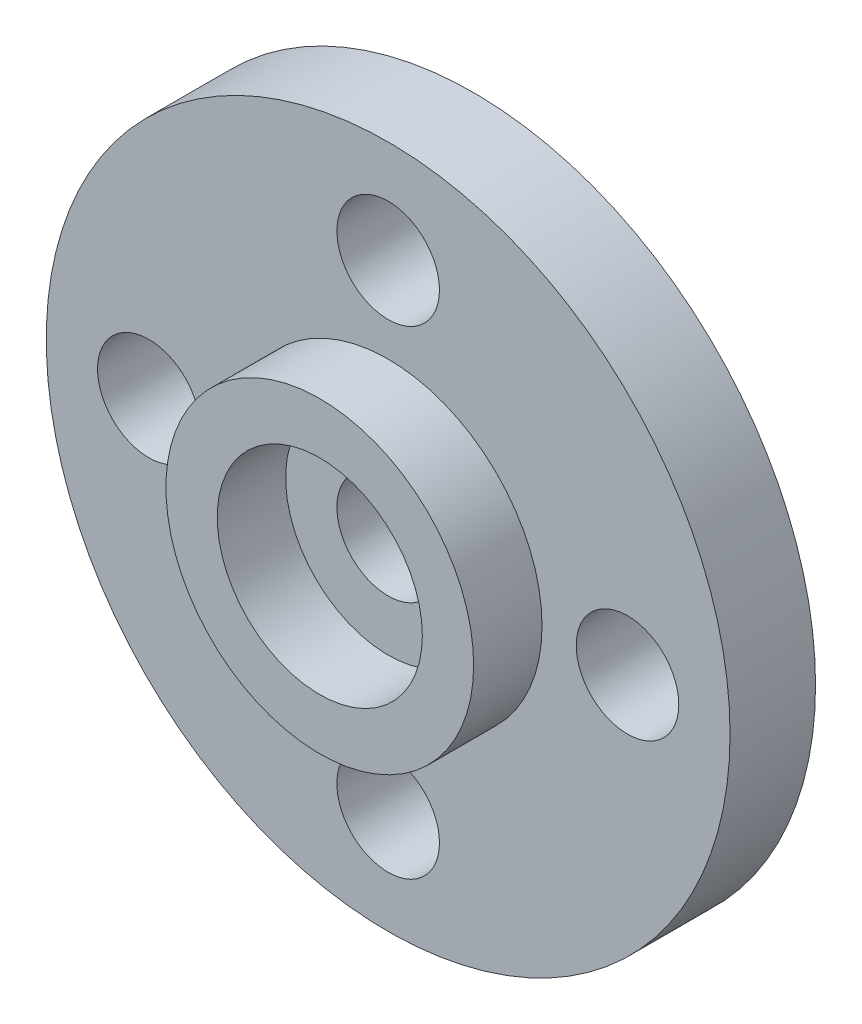
ISO-10303-21;
HEADER;
FILE_DESCRIPTION(('STEP AP214'),'2;1');
FILE_NAME('part.step','',(''),(''),'','','');
FILE_SCHEMA(('AUTOMOTIVE_DESIGN { 1 0 10303 214 1 1 1 1 }'));
ENDSEC;
DATA;
#1=APPLICATION_CONTEXT('core data for automotive mechanical design processes');
#2=APPLICATION_PROTOCOL_DEFINITION('international standard','automotive_design',2000,#1);
#3=PRODUCT_CONTEXT('',#1,'mechanical');
#4=PRODUCT('Part','Part','',(#3));
#5=PRODUCT_RELATED_PRODUCT_CATEGORY('part','',(#4));
#6=PRODUCT_DEFINITION_FORMATION('','',#4);
#7=PRODUCT_DEFINITION_CONTEXT('part definition',#1,'design');
#8=PRODUCT_DEFINITION('design','',#6,#7);
#9=PRODUCT_DEFINITION_SHAPE('','',#8);
#10=(LENGTH_UNIT() NAMED_UNIT(*) SI_UNIT(.MILLI.,.METRE.));
#11=(NAMED_UNIT(*) PLANE_ANGLE_UNIT() SI_UNIT($,.RADIAN.));
#12=(NAMED_UNIT(*) SI_UNIT($,.STERADIAN.) SOLID_ANGLE_UNIT());
#13=UNCERTAINTY_MEASURE_WITH_UNIT(LENGTH_MEASURE(1.E-05),#10,'distance_accuracy_value','');
#14=(GEOMETRIC_REPRESENTATION_CONTEXT(3) GLOBAL_UNCERTAINTY_ASSIGNED_CONTEXT((#13)) GLOBAL_UNIT_ASSIGNED_CONTEXT((#10,
#11,#12)) REPRESENTATION_CONTEXT('',''));
#15=CARTESIAN_POINT('',(0.,0.,0.));
#16=DIRECTION('',(0.,0.,1.));
#17=DIRECTION('',(1.,0.,0.));
#18=AXIS2_PLACEMENT_3D('',#15,#16,#17);
#19=CARTESIAN_POINT('',(0.,0.,2.5));
#20=DIRECTION('',(0.,0.,1.));
#21=DIRECTION('',(1.,0.,0.));
#22=AXIS2_PLACEMENT_3D('',#19,#20,#21);
#23=PLANE('',#22);
#24=CARTESIAN_POINT('',(0.,0.,2.5));
#25=DIRECTION('',(0.,0.,1.));
#26=DIRECTION('',(1.,0.,0.));
#27=AXIS2_PLACEMENT_3D('',#24,#25,#26);
#28=CIRCLE('',#27,4.5);
#29=CARTESIAN_POINT('',(4.5,0.,2.5));
#30=VERTEX_POINT('',#29);
#31=EDGE_CURVE('E90',#30,#30,#28,.T.);
#32=ORIENTED_EDGE('',*,*,#31,.F.);
#33=EDGE_LOOP('',(#32));
#34=FACE_BOUND('',#33,.T.);
#35=CARTESIAN_POINT('',(0.,-7.,2.5));
#36=DIRECTION('',(0.,0.,1.));
#37=DIRECTION('',(1.,0.,0.));
#38=AXIS2_PLACEMENT_3D('',#35,#36,#37);
#39=CIRCLE('',#38,1.5);
#40=CARTESIAN_POINT('',(1.49999999999995,-7.,2.5));
#41=VERTEX_POINT('',#40);
#42=EDGE_CURVE('E70',#41,#41,#39,.T.);
#43=ORIENTED_EDGE('',*,*,#42,.F.);
#44=EDGE_LOOP('',(#43));
#45=FACE_BOUND('',#44,.T.);
#46=CARTESIAN_POINT('',(0.,7.,2.5));
#47=DIRECTION('',(0.,0.,1.));
#48=DIRECTION('',(1.,0.,0.));
#49=AXIS2_PLACEMENT_3D('',#46,#47,#48);
#50=CIRCLE('',#49,1.5);
#51=CARTESIAN_POINT('',(1.5,7.,2.5));
#52=VERTEX_POINT('',#51);
#53=EDGE_CURVE('E56',#52,#52,#50,.T.);
#54=ORIENTED_EDGE('',*,*,#53,.F.);
#55=EDGE_LOOP('',(#54));
#56=FACE_BOUND('',#55,.T.);
#57=CARTESIAN_POINT('',(0.,0.,2.5));
#58=DIRECTION('',(0.,0.,1.));
#59=DIRECTION('',(1.,0.,0.));
#60=AXIS2_PLACEMENT_3D('',#57,#58,#59);
#61=CIRCLE('',#60,10.);
#62=CARTESIAN_POINT('',(10.,0.,2.5));
#63=VERTEX_POINT('',#62);
#64=EDGE_CURVE('E46',#63,#63,#61,.T.);
#65=ORIENTED_EDGE('',*,*,#64,.T.);
#66=EDGE_LOOP('',(#65));
#67=FACE_BOUND('',#66,.T.);
#68=CARTESIAN_POINT('',(7.,0.,2.5));
#69=DIRECTION('',(0.,0.,1.));
#70=DIRECTION('',(1.,0.,0.));
#71=AXIS2_PLACEMENT_3D('',#68,#69,#70);
#72=CIRCLE('',#71,1.5);
#73=CARTESIAN_POINT('',(8.5,0.,2.5));
#74=VERTEX_POINT('',#73);
#75=EDGE_CURVE('E62',#74,#74,#72,.T.);
#76=ORIENTED_EDGE('',*,*,#75,.F.);
#77=EDGE_LOOP('',(#76));
#78=FACE_BOUND('',#77,.T.);
#79=CARTESIAN_POINT('',(-7.0000000000001,1.71082585603315E-13,2.5));
#80=DIRECTION('',(0.,0.,1.));
#81=DIRECTION('',(1.,0.,0.));
#82=AXIS2_PLACEMENT_3D('',#79,#80,#81);
#83=CIRCLE('',#82,1.49999999999988);
#84=CARTESIAN_POINT('',(-5.50000000000022,1.71082585603315E-13,2.5));
#85=VERTEX_POINT('',#84);
#86=EDGE_CURVE('E78',#85,#85,#83,.T.);
#87=ORIENTED_EDGE('',*,*,#86,.F.);
#88=EDGE_LOOP('',(#87));
#89=FACE_BOUND('',#88,.T.);
#90=ADVANCED_FACE('F37',(#34,#45,#56,#67,#78,#89),#23,.T.);
#91=CARTESIAN_POINT('',(0.,0.,0.));
#92=DIRECTION('',(0.,0.,1.));
#93=DIRECTION('',(1.,0.,0.));
#94=AXIS2_PLACEMENT_3D('',#91,#92,#93);
#95=PLANE('',#94);
#96=CARTESIAN_POINT('',(0.,0.,0.));
#97=DIRECTION('',(0.,0.,1.));
#98=DIRECTION('',(1.,0.,0.));
#99=AXIS2_PLACEMENT_3D('',#96,#97,#98);
#100=CIRCLE('',#99,1.5);
#101=CARTESIAN_POINT('',(1.5,0.,0.));
#102=VERTEX_POINT('',#101);
#103=EDGE_CURVE('E41',#102,#102,#100,.T.);
#104=ORIENTED_EDGE('',*,*,#103,.T.);
#105=EDGE_LOOP('',(#104));
#106=FACE_BOUND('',#105,.T.);
#107=CARTESIAN_POINT('',(0.,0.,0.));
#108=DIRECTION('',(0.,0.,1.));
#109=DIRECTION('',(1.,0.,0.));
#110=AXIS2_PLACEMENT_3D('',#107,#108,#109);
#111=CIRCLE('',#110,10.);
#112=CARTESIAN_POINT('',(10.,0.,0.));
#113=VERTEX_POINT('',#112);
#114=EDGE_CURVE('E51',#113,#113,#111,.T.);
#115=ORIENTED_EDGE('',*,*,#114,.F.);
#116=EDGE_LOOP('',(#115));
#117=FACE_BOUND('',#116,.T.);
#118=CARTESIAN_POINT('',(0.,7.,0.));
#119=DIRECTION('',(0.,0.,1.));
#120=DIRECTION('',(1.,0.,0.));
#121=AXIS2_PLACEMENT_3D('',#118,#119,#120);
#122=CIRCLE('',#121,1.5);
#123=CARTESIAN_POINT('',(1.5,7.,0.));
#124=VERTEX_POINT('',#123);
#125=EDGE_CURVE('E58',#124,#124,#122,.T.);
#126=ORIENTED_EDGE('',*,*,#125,.T.);
#127=EDGE_LOOP('',(#126));
#128=FACE_BOUND('',#127,.T.);
#129=CARTESIAN_POINT('',(7.,0.,0.));
#130=DIRECTION('',(0.,0.,1.));
#131=DIRECTION('',(1.,0.,0.));
#132=AXIS2_PLACEMENT_3D('',#129,#130,#131);
#133=CIRCLE('',#132,1.5);
#134=CARTESIAN_POINT('',(8.5,0.,0.));
#135=VERTEX_POINT('',#134);
#136=EDGE_CURVE('E66',#135,#135,#133,.T.);
#137=ORIENTED_EDGE('',*,*,#136,.T.);
#138=EDGE_LOOP('',(#137));
#139=FACE_BOUND('',#138,.T.);
#140=CARTESIAN_POINT('',(0.,-7.,0.));
#141=DIRECTION('',(0.,0.,1.));
#142=DIRECTION('',(1.,0.,0.));
#143=AXIS2_PLACEMENT_3D('',#140,#141,#142);
#144=CIRCLE('',#143,1.5);
#145=CARTESIAN_POINT('',(1.49999999999995,-7.,0.));
#146=VERTEX_POINT('',#145);
#147=EDGE_CURVE('E74',#146,#146,#144,.T.);
#148=ORIENTED_EDGE('',*,*,#147,.T.);
#149=EDGE_LOOP('',(#148));
#150=FACE_BOUND('',#149,.T.);
#151=CARTESIAN_POINT('',(-7.0000000000001,1.71082585603315E-13,0.));
#152=DIRECTION('',(0.,0.,1.));
#153=DIRECTION('',(1.,0.,0.));
#154=AXIS2_PLACEMENT_3D('',#151,#152,#153);
#155=CIRCLE('',#154,1.49999999999988);
#156=CARTESIAN_POINT('',(-5.50000000000022,1.71082585603315E-13,0.));
#157=VERTEX_POINT('',#156);
#158=EDGE_CURVE('E82',#157,#157,#155,.T.);
#159=ORIENTED_EDGE('',*,*,#158,.T.);
#160=EDGE_LOOP('',(#159));
#161=FACE_BOUND('',#160,.T.);
#162=ADVANCED_FACE('F110',(#106,#117,#128,#139,#150,#161),#95,.F.);
#163=CARTESIAN_POINT('',(0.,0.,2.5));
#164=DIRECTION('',(0.,0.,-1.));
#165=DIRECTION('',(-1.,0.,0.));
#166=AXIS2_PLACEMENT_3D('',#163,#164,#165);
#167=CYLINDRICAL_SURFACE('',#166,10.);
#168=ORIENTED_EDGE('',*,*,#64,.F.);
#169=EDGE_LOOP('',(#168));
#170=FACE_BOUND('',#169,.T.);
#171=ORIENTED_EDGE('',*,*,#114,.T.);
#172=EDGE_LOOP('',(#171));
#173=FACE_BOUND('',#172,.T.);
#174=ADVANCED_FACE('F39',(#170,#173),#167,.T.);
#175=CARTESIAN_POINT('',(0.,7.,2.5));
#176=DIRECTION('',(0.,0.,-1.));
#177=DIRECTION('',(-1.,0.,0.));
#178=AXIS2_PLACEMENT_3D('',#175,#176,#177);
#179=CYLINDRICAL_SURFACE('',#178,1.5);
#180=ORIENTED_EDGE('',*,*,#53,.T.);
#181=EDGE_LOOP('',(#180));
#182=FACE_BOUND('',#181,.T.);
#183=ORIENTED_EDGE('',*,*,#125,.F.);
#184=EDGE_LOOP('',(#183));
#185=FACE_BOUND('',#184,.T.);
#186=ADVANCED_FACE('F132',(#182,#185),#179,.F.);
#187=CARTESIAN_POINT('',(7.,0.,2.5));
#188=DIRECTION('',(0.,0.,-1.));
#189=DIRECTION('',(-1.,0.,0.));
#190=AXIS2_PLACEMENT_3D('',#187,#188,#189);
#191=CYLINDRICAL_SURFACE('',#190,1.5);
#192=ORIENTED_EDGE('',*,*,#75,.T.);
#193=EDGE_LOOP('',(#192));
#194=FACE_BOUND('',#193,.T.);
#195=ORIENTED_EDGE('',*,*,#136,.F.);
#196=EDGE_LOOP('',(#195));
#197=FACE_BOUND('',#196,.T.);
#198=ADVANCED_FACE('F135',(#194,#197),#191,.F.);
#199=CARTESIAN_POINT('',(0.,-7.,2.5));
#200=DIRECTION('',(0.,0.,-1.));
#201=DIRECTION('',(-1.,0.,0.));
#202=AXIS2_PLACEMENT_3D('',#199,#200,#201);
#203=CYLINDRICAL_SURFACE('',#202,1.5);
#204=ORIENTED_EDGE('',*,*,#42,.T.);
#205=EDGE_LOOP('',(#204));
#206=FACE_BOUND('',#205,.T.);
#207=ORIENTED_EDGE('',*,*,#147,.F.);
#208=EDGE_LOOP('',(#207));
#209=FACE_BOUND('',#208,.T.);
#210=ADVANCED_FACE('F139',(#206,#209),#203,.F.);
#211=CARTESIAN_POINT('',(-7.0000000000001,1.71082585603315E-13,2.5));
#212=DIRECTION('',(0.,0.,-1.));
#213=DIRECTION('',(-1.,0.,0.));
#214=AXIS2_PLACEMENT_3D('',#211,#212,#213);
#215=CYLINDRICAL_SURFACE('',#214,1.49999999999988);
#216=ORIENTED_EDGE('',*,*,#86,.T.);
#217=EDGE_LOOP('',(#216));
#218=FACE_BOUND('',#217,.T.);
#219=ORIENTED_EDGE('',*,*,#158,.F.);
#220=EDGE_LOOP('',(#219));
#221=FACE_BOUND('',#220,.T.);
#222=ADVANCED_FACE('F143',(#218,#221),#215,.F.);
#223=CARTESIAN_POINT('',(0.,0.,4.5));
#224=DIRECTION('',(0.,0.,1.));
#225=DIRECTION('',(1.,0.,0.));
#226=AXIS2_PLACEMENT_3D('',#223,#224,#225);
#227=PLANE('',#226);
#228=CARTESIAN_POINT('',(0.,0.,4.5));
#229=DIRECTION('',(0.,0.,1.));
#230=DIRECTION('',(1.,0.,0.));
#231=AXIS2_PLACEMENT_3D('',#228,#229,#230);
#232=CIRCLE('',#231,4.5);
#233=CARTESIAN_POINT('',(4.5,0.,4.5));
#234=VERTEX_POINT('',#233);
#235=EDGE_CURVE('E86',#234,#234,#232,.T.);
#236=ORIENTED_EDGE('',*,*,#235,.T.);
#237=EDGE_LOOP('',(#236));
#238=FACE_BOUND('',#237,.T.);
#239=CARTESIAN_POINT('',(0.,0.,4.5));
#240=DIRECTION('',(0.,0.,1.));
#241=DIRECTION('',(1.,0.,0.));
#242=AXIS2_PLACEMENT_3D('',#239,#240,#241);
#243=CIRCLE('',#242,3.);
#244=CARTESIAN_POINT('',(3.,0.,4.5));
#245=VERTEX_POINT('',#244);
#246=EDGE_CURVE('E94',#245,#245,#243,.T.);
#247=ORIENTED_EDGE('',*,*,#246,.F.);
#248=EDGE_LOOP('',(#247));
#249=FACE_BOUND('',#248,.T.);
#250=ADVANCED_FACE('F147',(#238,#249),#227,.T.);
#251=CARTESIAN_POINT('',(0.,0.,4.5));
#252=DIRECTION('',(0.,0.,-1.));
#253=DIRECTION('',(-1.,0.,0.));
#254=AXIS2_PLACEMENT_3D('',#251,#252,#253);
#255=CYLINDRICAL_SURFACE('',#254,4.5);
#256=ORIENTED_EDGE('',*,*,#235,.F.);
#257=EDGE_LOOP('',(#256));
#258=FACE_BOUND('',#257,.T.);
#259=ORIENTED_EDGE('',*,*,#31,.T.);
#260=EDGE_LOOP('',(#259));
#261=FACE_BOUND('',#260,.T.);
#262=ADVANCED_FACE('F149',(#258,#261),#255,.T.);
#263=CARTESIAN_POINT('',(0.,0.,4.5));
#264=DIRECTION('',(0.,0.,-1.));
#265=DIRECTION('',(-1.,0.,0.));
#266=AXIS2_PLACEMENT_3D('',#263,#264,#265);
#267=CYLINDRICAL_SURFACE('',#266,3.);
#268=ORIENTED_EDGE('',*,*,#246,.T.);
#269=EDGE_LOOP('',(#268));
#270=FACE_BOUND('',#269,.T.);
#271=CARTESIAN_POINT('',(0.,0.,2.5));
#272=DIRECTION('',(0.,0.,1.));
#273=DIRECTION('',(1.,0.,0.));
#274=AXIS2_PLACEMENT_3D('',#271,#272,#273);
#275=CIRCLE('',#274,3.);
#276=CARTESIAN_POINT('',(3.,0.,2.5));
#277=VERTEX_POINT('',#276);
#278=EDGE_CURVE('E10',#277,#277,#275,.F.);
#279=ORIENTED_EDGE('',*,*,#278,.T.);
#280=EDGE_LOOP('',(#279));
#281=FACE_BOUND('',#280,.T.);
#282=ADVANCED_FACE('F120',(#270,#281),#267,.F.);
#283=CARTESIAN_POINT('',(0.,0.,2.5));
#284=DIRECTION('',(0.,0.,1.));
#285=DIRECTION('',(1.,0.,0.));
#286=AXIS2_PLACEMENT_3D('',#283,#284,#285);
#287=CIRCLE('',#286,1.5);
#288=CARTESIAN_POINT('',(1.5,0.,2.5));
#289=VERTEX_POINT('',#288);
#290=EDGE_CURVE('E101',#289,#289,#287,.T.);
#291=ORIENTED_EDGE('',*,*,#290,.F.);
#292=EDGE_LOOP('',(#291));
#293=FACE_BOUND('',#292,.T.);
#294=ORIENTED_EDGE('',*,*,#278,.F.);
#295=EDGE_LOOP('',(#294));
#296=FACE_BOUND('',#295,.T.);
#297=ADVANCED_FACE('F115',(#293,#296),#23,.T.);
#298=CARTESIAN_POINT('',(0.,0.,-0.5));
#299=DIRECTION('',(0.,0.,1.));
#300=DIRECTION('',(1.,0.,0.));
#301=AXIS2_PLACEMENT_3D('',#298,#299,#300);
#302=CYLINDRICAL_SURFACE('',#301,1.5);
#303=ORIENTED_EDGE('',*,*,#290,.T.);
#304=EDGE_LOOP('',(#303));
#305=FACE_BOUND('',#304,.T.);
#306=ORIENTED_EDGE('',*,*,#103,.F.);
#307=EDGE_LOOP('',(#306));
#308=FACE_BOUND('',#307,.T.);
#309=ADVANCED_FACE('F113',(#305,#308),#302,.F.);
#310=CLOSED_SHELL('',(#90,#162,#174,#186,#198,#210,#222,#250,#262,#282,#297,#309));
#311=MANIFOLD_SOLID_BREP('B2',#310);
#312=ADVANCED_BREP_SHAPE_REPRESENTATION('',(#18,#311),#14);
#313=SHAPE_DEFINITION_REPRESENTATION(#9,#312);
ENDSEC;
END-ISO-10303-21;
